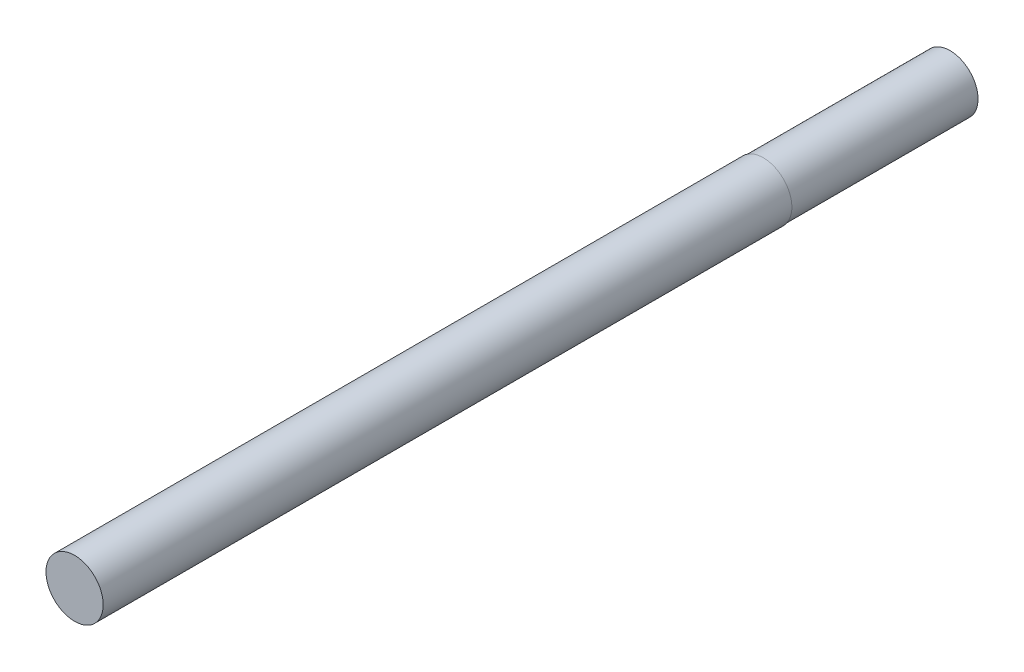
ISO-10303-21;
HEADER;
FILE_DESCRIPTION(('STEP AP214'),'2;1');
FILE_NAME('part.step','',(''),(''),'','','');
FILE_SCHEMA(('AUTOMOTIVE_DESIGN { 1 0 10303 214 1 1 1 1 }'));
ENDSEC;
DATA;
#1=APPLICATION_CONTEXT('core data for automotive mechanical design processes');
#2=APPLICATION_PROTOCOL_DEFINITION('international standard','automotive_design',2000,#1);
#3=PRODUCT_CONTEXT('',#1,'mechanical');
#4=PRODUCT('Part','Part','',(#3));
#5=PRODUCT_RELATED_PRODUCT_CATEGORY('part','',(#4));
#6=PRODUCT_DEFINITION_FORMATION('','',#4);
#7=PRODUCT_DEFINITION_CONTEXT('part definition',#1,'design');
#8=PRODUCT_DEFINITION('design','',#6,#7);
#9=PRODUCT_DEFINITION_SHAPE('','',#8);
#10=(LENGTH_UNIT() NAMED_UNIT(*) SI_UNIT(.MILLI.,.METRE.));
#11=(NAMED_UNIT(*) PLANE_ANGLE_UNIT() SI_UNIT($,.RADIAN.));
#12=(NAMED_UNIT(*) SI_UNIT($,.STERADIAN.) SOLID_ANGLE_UNIT());
#13=UNCERTAINTY_MEASURE_WITH_UNIT(LENGTH_MEASURE(1.E-05),#10,'distance_accuracy_value','');
#14=(GEOMETRIC_REPRESENTATION_CONTEXT(3) GLOBAL_UNCERTAINTY_ASSIGNED_CONTEXT((#13)) GLOBAL_UNIT_ASSIGNED_CONTEXT((#10,
#11,#12)) REPRESENTATION_CONTEXT('',''));
#15=CARTESIAN_POINT('',(0.,0.,0.));
#16=DIRECTION('',(0.,0.,1.));
#17=DIRECTION('',(1.,0.,0.));
#18=AXIS2_PLACEMENT_3D('',#15,#16,#17);
#19=CARTESIAN_POINT('',(0.,0.,75.));
#20=DIRECTION('',(0.,0.,-1.));
#21=DIRECTION('',(-1.,0.,0.));
#22=AXIS2_PLACEMENT_3D('',#19,#20,#21);
#23=CYLINDRICAL_SURFACE('',#22,2.45);
#24=CARTESIAN_POINT('',(0.,0.,75.));
#25=DIRECTION('',(0.,0.,1.));
#26=DIRECTION('',(1.,0.,0.));
#27=AXIS2_PLACEMENT_3D('',#24,#25,#26);
#28=CIRCLE('',#27,2.45);
#29=CARTESIAN_POINT('',(2.45,0.,75.));
#30=VERTEX_POINT('',#29);
#31=EDGE_CURVE('E10',#30,#30,#28,.T.);
#32=ORIENTED_EDGE('',*,*,#31,.F.);
#33=EDGE_LOOP('',(#32));
#34=FACE_BOUND('',#33,.T.);
#35=CARTESIAN_POINT('',(0.,0.,16.));
#36=DIRECTION('',(0.,0.,-1.));
#37=DIRECTION('',(-1.,0.,0.));
#38=AXIS2_PLACEMENT_3D('',#35,#36,#37);
#39=CIRCLE('',#38,2.45);
#40=CARTESIAN_POINT('',(-2.45,0.,16.));
#41=VERTEX_POINT('',#40);
#42=EDGE_CURVE('E41',#41,#41,#39,.T.);
#43=ORIENTED_EDGE('',*,*,#42,.F.);
#44=EDGE_LOOP('',(#43));
#45=FACE_BOUND('',#44,.T.);
#46=ADVANCED_FACE('F35',(#34,#45),#23,.T.);
#47=CARTESIAN_POINT('',(0.,0.,75.));
#48=DIRECTION('',(0.,0.,1.));
#49=DIRECTION('',(1.,0.,0.));
#50=AXIS2_PLACEMENT_3D('',#47,#48,#49);
#51=PLANE('',#50);
#52=ORIENTED_EDGE('',*,*,#31,.T.);
#53=EDGE_LOOP('',(#52));
#54=FACE_BOUND('',#53,.T.);
#55=ADVANCED_FACE('F66',(#54),#51,.T.);
#56=CARTESIAN_POINT('',(0.,0.,16.));
#57=DIRECTION('',(0.,0.,-1.));
#58=DIRECTION('',(-1.,0.,0.));
#59=AXIS2_PLACEMENT_3D('',#56,#57,#58);
#60=PLANE('',#59);
#61=CARTESIAN_POINT('',(0.,0.,16.));
#62=DIRECTION('',(0.,0.,-1.));
#63=DIRECTION('',(-1.,0.,0.));
#64=AXIS2_PLACEMENT_3D('',#61,#62,#63);
#65=CIRCLE('',#64,2.4);
#66=CARTESIAN_POINT('',(-2.4,0.,16.));
#67=VERTEX_POINT('',#66);
#68=EDGE_CURVE('E45',#67,#67,#65,.T.);
#69=ORIENTED_EDGE('',*,*,#68,.F.);
#70=EDGE_LOOP('',(#69));
#71=FACE_BOUND('',#70,.T.);
#72=ORIENTED_EDGE('',*,*,#42,.T.);
#73=EDGE_LOOP('',(#72));
#74=FACE_BOUND('',#73,.T.);
#75=ADVANCED_FACE('F59',(#71,#74),#60,.T.);
#76=CARTESIAN_POINT('',(0.,0.,16.));
#77=DIRECTION('',(0.,0.,-1.));
#78=DIRECTION('',(-1.,0.,0.));
#79=AXIS2_PLACEMENT_3D('',#76,#77,#78);
#80=CYLINDRICAL_SURFACE('',#79,2.4);
#81=ORIENTED_EDGE('',*,*,#68,.T.);
#82=EDGE_LOOP('',(#81));
#83=FACE_BOUND('',#82,.T.);
#84=CARTESIAN_POINT('',(0.,0.,0.));
#85=DIRECTION('',(0.,0.,-1.));
#86=DIRECTION('',(-1.,0.,0.));
#87=AXIS2_PLACEMENT_3D('',#84,#85,#86);
#88=CIRCLE('',#87,2.4);
#89=CARTESIAN_POINT('',(-2.4,0.,0.));
#90=VERTEX_POINT('',#89);
#91=EDGE_CURVE('E49',#90,#90,#88,.T.);
#92=ORIENTED_EDGE('',*,*,#91,.F.);
#93=EDGE_LOOP('',(#92));
#94=FACE_BOUND('',#93,.T.);
#95=ADVANCED_FACE('F57',(#83,#94),#80,.T.);
#96=CARTESIAN_POINT('',(0.,0.,0.));
#97=DIRECTION('',(0.,0.,1.));
#98=DIRECTION('',(1.,0.,0.));
#99=AXIS2_PLACEMENT_3D('',#96,#97,#98);
#100=PLANE('',#99);
#101=ORIENTED_EDGE('',*,*,#91,.T.);
#102=EDGE_LOOP('',(#101));
#103=FACE_BOUND('',#102,.T.);
#104=ADVANCED_FACE('F55',(#103),#100,.F.);
#105=CLOSED_SHELL('',(#46,#55,#75,#95,#104));
#106=MANIFOLD_SOLID_BREP('B2',#105);
#107=ADVANCED_BREP_SHAPE_REPRESENTATION('',(#18,#106),#14);
#108=SHAPE_DEFINITION_REPRESENTATION(#9,#107);
ENDSEC;
END-ISO-10303-21;
